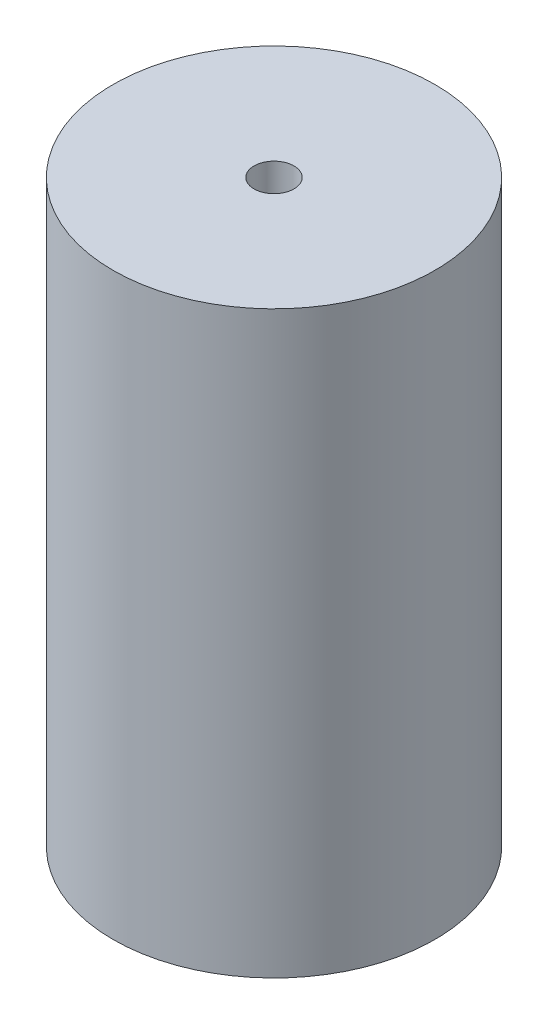
ISO-10303-21;
HEADER;
FILE_DESCRIPTION(('STEP AP214'),'2;1');
FILE_NAME('part.step','',(''),(''),'','','');
FILE_SCHEMA(('AUTOMOTIVE_DESIGN { 1 0 10303 214 1 1 1 1 }'));
ENDSEC;
DATA;
#1=APPLICATION_CONTEXT('core data for automotive mechanical design processes');
#2=APPLICATION_PROTOCOL_DEFINITION('international standard','automotive_design',2000,#1);
#3=PRODUCT_CONTEXT('',#1,'mechanical');
#4=PRODUCT('Part','Part','',(#3));
#5=PRODUCT_RELATED_PRODUCT_CATEGORY('part','',(#4));
#6=PRODUCT_DEFINITION_FORMATION('','',#4);
#7=PRODUCT_DEFINITION_CONTEXT('part definition',#1,'design');
#8=PRODUCT_DEFINITION('design','',#6,#7);
#9=PRODUCT_DEFINITION_SHAPE('','',#8);
#10=(LENGTH_UNIT() NAMED_UNIT(*) SI_UNIT(.MILLI.,.METRE.));
#11=(NAMED_UNIT(*) PLANE_ANGLE_UNIT() SI_UNIT($,.RADIAN.));
#12=(NAMED_UNIT(*) SI_UNIT($,.STERADIAN.) SOLID_ANGLE_UNIT());
#13=UNCERTAINTY_MEASURE_WITH_UNIT(LENGTH_MEASURE(1.E-05),#10,'distance_accuracy_value','');
#14=(GEOMETRIC_REPRESENTATION_CONTEXT(3) GLOBAL_UNCERTAINTY_ASSIGNED_CONTEXT((#13)) GLOBAL_UNIT_ASSIGNED_CONTEXT((#10,
#11,#12)) REPRESENTATION_CONTEXT('',''));
#15=CARTESIAN_POINT('',(0.,0.,0.));
#16=DIRECTION('',(0.,0.,1.));
#17=DIRECTION('',(1.,0.,0.));
#18=AXIS2_PLACEMENT_3D('',#15,#16,#17);
#19=CARTESIAN_POINT('',(0.,114.3,0.));
#20=DIRECTION('',(0.,-1.,0.));
#21=DIRECTION('',(0.,0.,-1.));
#22=AXIS2_PLACEMENT_3D('',#19,#20,#21);
#23=CYLINDRICAL_SURFACE('',#22,31.75);
#24=CARTESIAN_POINT('',(0.,114.3,0.));
#25=DIRECTION('',(0.,1.,0.));
#26=DIRECTION('',(0.,0.,1.));
#27=AXIS2_PLACEMENT_3D('',#24,#25,#26);
#28=CIRCLE('',#27,31.75);
#29=CARTESIAN_POINT('',(0.,114.3,31.75));
#30=VERTEX_POINT('',#29);
#31=EDGE_CURVE('E10',#30,#30,#28,.T.);
#32=ORIENTED_EDGE('',*,*,#31,.F.);
#33=EDGE_LOOP('',(#32));
#34=FACE_BOUND('',#33,.T.);
#35=CARTESIAN_POINT('',(0.,0.,0.));
#36=DIRECTION('',(0.,1.,0.));
#37=DIRECTION('',(0.,0.,1.));
#38=AXIS2_PLACEMENT_3D('',#35,#36,#37);
#39=CIRCLE('',#38,31.75);
#40=CARTESIAN_POINT('',(0.,0.,31.75));
#41=VERTEX_POINT('',#40);
#42=EDGE_CURVE('E34',#41,#41,#39,.T.);
#43=ORIENTED_EDGE('',*,*,#42,.T.);
#44=EDGE_LOOP('',(#43));
#45=FACE_BOUND('',#44,.T.);
#46=ADVANCED_FACE('F31',(#34,#45),#23,.T.);
#47=CARTESIAN_POINT('',(0.,114.3,0.));
#48=DIRECTION('',(0.,1.,0.));
#49=DIRECTION('',(0.,0.,1.));
#50=AXIS2_PLACEMENT_3D('',#47,#48,#49);
#51=PLANE('',#50);
#52=CARTESIAN_POINT('',(0.,114.3,0.));
#53=DIRECTION('',(0.,1.,0.));
#54=DIRECTION('',(0.,0.,1.));
#55=AXIS2_PLACEMENT_3D('',#52,#53,#54);
#56=CIRCLE('',#55,3.937);
#57=CARTESIAN_POINT('',(0.,114.3,3.937));
#58=VERTEX_POINT('',#57);
#59=EDGE_CURVE('E43',#58,#58,#56,.T.);
#60=ORIENTED_EDGE('',*,*,#59,.F.);
#61=EDGE_LOOP('',(#60));
#62=FACE_BOUND('',#61,.T.);
#63=ORIENTED_EDGE('',*,*,#31,.T.);
#64=EDGE_LOOP('',(#63));
#65=FACE_BOUND('',#64,.T.);
#66=ADVANCED_FACE('F58',(#62,#65),#51,.T.);
#67=CARTESIAN_POINT('',(0.,0.,0.));
#68=DIRECTION('',(0.,1.,0.));
#69=DIRECTION('',(0.,0.,1.));
#70=AXIS2_PLACEMENT_3D('',#67,#68,#69);
#71=PLANE('',#70);
#72=ORIENTED_EDGE('',*,*,#42,.F.);
#73=EDGE_LOOP('',(#72));
#74=FACE_BOUND('',#73,.T.);
#75=ADVANCED_FACE('F54',(#74),#71,.F.);
#76=CARTESIAN_POINT('',(0.,25.4,0.));
#77=DIRECTION('',(0.,1.,0.));
#78=DIRECTION('',(0.,0.,1.));
#79=AXIS2_PLACEMENT_3D('',#76,#77,#78);
#80=CYLINDRICAL_SURFACE('',#79,3.937);
#81=CARTESIAN_POINT('',(0.,25.4,0.));
#82=DIRECTION('',(0.,1.,0.));
#83=DIRECTION('',(0.,0.,1.));
#84=AXIS2_PLACEMENT_3D('',#81,#82,#83);
#85=CIRCLE('',#84,3.937);
#86=CARTESIAN_POINT('',(0.,25.4,3.937));
#87=VERTEX_POINT('',#86);
#88=EDGE_CURVE('E41',#87,#87,#85,.T.);
#89=ORIENTED_EDGE('',*,*,#88,.F.);
#90=EDGE_LOOP('',(#89));
#91=FACE_BOUND('',#90,.T.);
#92=ORIENTED_EDGE('',*,*,#59,.T.);
#93=EDGE_LOOP('',(#92));
#94=FACE_BOUND('',#93,.T.);
#95=ADVANCED_FACE('F51',(#91,#94),#80,.F.);
#96=CARTESIAN_POINT('',(0.,25.4,0.));
#97=DIRECTION('',(0.,1.,0.));
#98=DIRECTION('',(0.,0.,1.));
#99=AXIS2_PLACEMENT_3D('',#96,#97,#98);
#100=PLANE('',#99);
#101=ORIENTED_EDGE('',*,*,#88,.T.);
#102=EDGE_LOOP('',(#101));
#103=FACE_BOUND('',#102,.T.);
#104=ADVANCED_FACE('F49',(#103),#100,.T.);
#105=CLOSED_SHELL('',(#46,#66,#75,#95,#104));
#106=MANIFOLD_SOLID_BREP('B2',#105);
#107=ADVANCED_BREP_SHAPE_REPRESENTATION('',(#18,#106),#14);
#108=SHAPE_DEFINITION_REPRESENTATION(#9,#107);
ENDSEC;
END-ISO-10303-21;
